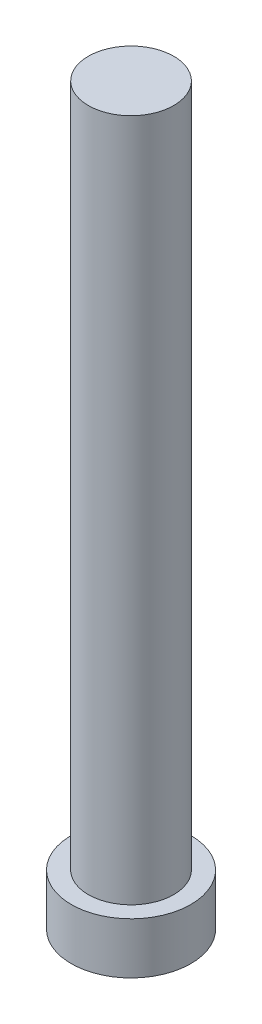
ISO-10303-21;
HEADER;
FILE_DESCRIPTION(('STEP AP214'),'2;1');
FILE_NAME('part.step','',(''),(''),'','','');
FILE_SCHEMA(('AUTOMOTIVE_DESIGN { 1 0 10303 214 1 1 1 1 }'));
ENDSEC;
DATA;
#1=APPLICATION_CONTEXT('core data for automotive mechanical design processes');
#2=APPLICATION_PROTOCOL_DEFINITION('international standard','automotive_design',2000,#1);
#3=PRODUCT_CONTEXT('',#1,'mechanical');
#4=PRODUCT('Part','Part','',(#3));
#5=PRODUCT_RELATED_PRODUCT_CATEGORY('part','',(#4));
#6=PRODUCT_DEFINITION_FORMATION('','',#4);
#7=PRODUCT_DEFINITION_CONTEXT('part definition',#1,'design');
#8=PRODUCT_DEFINITION('design','',#6,#7);
#9=PRODUCT_DEFINITION_SHAPE('','',#8);
#10=(LENGTH_UNIT() NAMED_UNIT(*) SI_UNIT(.MILLI.,.METRE.));
#11=(NAMED_UNIT(*) PLANE_ANGLE_UNIT() SI_UNIT($,.RADIAN.));
#12=(NAMED_UNIT(*) SI_UNIT($,.STERADIAN.) SOLID_ANGLE_UNIT());
#13=UNCERTAINTY_MEASURE_WITH_UNIT(LENGTH_MEASURE(1.E-05),#10,'distance_accuracy_value','');
#14=(GEOMETRIC_REPRESENTATION_CONTEXT(3) GLOBAL_UNCERTAINTY_ASSIGNED_CONTEXT((#13)) GLOBAL_UNIT_ASSIGNED_CONTEXT((#10,
#11,#12)) REPRESENTATION_CONTEXT('',''));
#15=CARTESIAN_POINT('',(0.,0.,0.));
#16=DIRECTION('',(0.,0.,1.));
#17=DIRECTION('',(1.,0.,0.));
#18=AXIS2_PLACEMENT_3D('',#15,#16,#17);
#19=CARTESIAN_POINT('',(0.,40.,0.));
#20=DIRECTION('',(0.,-1.,0.));
#21=DIRECTION('',(0.,0.,-1.));
#22=AXIS2_PLACEMENT_3D('',#19,#20,#21);
#23=CYLINDRICAL_SURFACE('',#22,2.5);
#24=CARTESIAN_POINT('',(0.,40.,0.));
#25=DIRECTION('',(0.,1.,0.));
#26=DIRECTION('',(0.,0.,1.));
#27=AXIS2_PLACEMENT_3D('',#24,#25,#26);
#28=CIRCLE('',#27,2.5);
#29=CARTESIAN_POINT('',(0.,40.,2.5));
#30=VERTEX_POINT('',#29);
#31=EDGE_CURVE('E10',#30,#30,#28,.T.);
#32=ORIENTED_EDGE('',*,*,#31,.F.);
#33=EDGE_LOOP('',(#32));
#34=FACE_BOUND('',#33,.T.);
#35=CARTESIAN_POINT('',(0.,0.,0.));
#36=DIRECTION('',(0.,1.,0.));
#37=DIRECTION('',(0.,0.,1.));
#38=AXIS2_PLACEMENT_3D('',#35,#36,#37);
#39=CIRCLE('',#38,2.5);
#40=CARTESIAN_POINT('',(0.,0.,2.5));
#41=VERTEX_POINT('',#40);
#42=EDGE_CURVE('E35',#41,#41,#39,.T.);
#43=ORIENTED_EDGE('',*,*,#42,.T.);
#44=EDGE_LOOP('',(#43));
#45=FACE_BOUND('',#44,.T.);
#46=ADVANCED_FACE('F32',(#34,#45),#23,.T.);
#47=CARTESIAN_POINT('',(0.,40.,0.));
#48=DIRECTION('',(0.,1.,0.));
#49=DIRECTION('',(0.,0.,1.));
#50=AXIS2_PLACEMENT_3D('',#47,#48,#49);
#51=PLANE('',#50);
#52=ORIENTED_EDGE('',*,*,#31,.T.);
#53=EDGE_LOOP('',(#52));
#54=FACE_BOUND('',#53,.T.);
#55=ADVANCED_FACE('F55',(#54),#51,.T.);
#56=CARTESIAN_POINT('',(0.,-3.,0.));
#57=DIRECTION('',(0.,1.,0.));
#58=DIRECTION('',(0.,0.,1.));
#59=AXIS2_PLACEMENT_3D('',#56,#57,#58);
#60=CYLINDRICAL_SURFACE('',#59,3.5);
#61=CARTESIAN_POINT('',(0.,-3.,0.));
#62=DIRECTION('',(0.,-1.,0.));
#63=DIRECTION('',(0.,0.,-1.));
#64=AXIS2_PLACEMENT_3D('',#61,#62,#63);
#65=CIRCLE('',#64,3.5);
#66=CARTESIAN_POINT('',(0.,-3.,-3.5));
#67=VERTEX_POINT('',#66);
#68=EDGE_CURVE('E42',#67,#67,#65,.T.);
#69=ORIENTED_EDGE('',*,*,#68,.F.);
#70=EDGE_LOOP('',(#69));
#71=FACE_BOUND('',#70,.T.);
#72=CARTESIAN_POINT('',(0.,0.,0.));
#73=DIRECTION('',(0.,-1.,0.));
#74=DIRECTION('',(0.,0.,-1.));
#75=AXIS2_PLACEMENT_3D('',#72,#73,#74);
#76=CIRCLE('',#75,3.5);
#77=CARTESIAN_POINT('',(0.,0.,-3.5));
#78=VERTEX_POINT('',#77);
#79=EDGE_CURVE('E44',#78,#78,#76,.T.);
#80=ORIENTED_EDGE('',*,*,#79,.T.);
#81=EDGE_LOOP('',(#80));
#82=FACE_BOUND('',#81,.T.);
#83=ADVANCED_FACE('F52',(#71,#82),#60,.T.);
#84=CARTESIAN_POINT('',(0.,-3.,0.));
#85=DIRECTION('',(0.,-1.,0.));
#86=DIRECTION('',(0.,0.,-1.));
#87=AXIS2_PLACEMENT_3D('',#84,#85,#86);
#88=PLANE('',#87);
#89=ORIENTED_EDGE('',*,*,#68,.T.);
#90=EDGE_LOOP('',(#89));
#91=FACE_BOUND('',#90,.T.);
#92=ADVANCED_FACE('F50',(#91),#88,.T.);
#93=CARTESIAN_POINT('',(0.,0.,0.));
#94=DIRECTION('',(0.,-1.,0.));
#95=DIRECTION('',(0.,0.,-1.));
#96=AXIS2_PLACEMENT_3D('',#93,#94,#95);
#97=PLANE('',#96);
#98=ORIENTED_EDGE('',*,*,#42,.F.);
#99=EDGE_LOOP('',(#98));
#100=FACE_BOUND('',#99,.T.);
#101=ORIENTED_EDGE('',*,*,#79,.F.);
#102=EDGE_LOOP('',(#101));
#103=FACE_BOUND('',#102,.T.);
#104=ADVANCED_FACE('F59',(#100,#103),#97,.F.);
#105=CLOSED_SHELL('',(#46,#55,#83,#92,#104));
#106=MANIFOLD_SOLID_BREP('B2',#105);
#107=ADVANCED_BREP_SHAPE_REPRESENTATION('',(#18,#106),#14);
#108=SHAPE_DEFINITION_REPRESENTATION(#9,#107);
ENDSEC;
END-ISO-10303-21;
